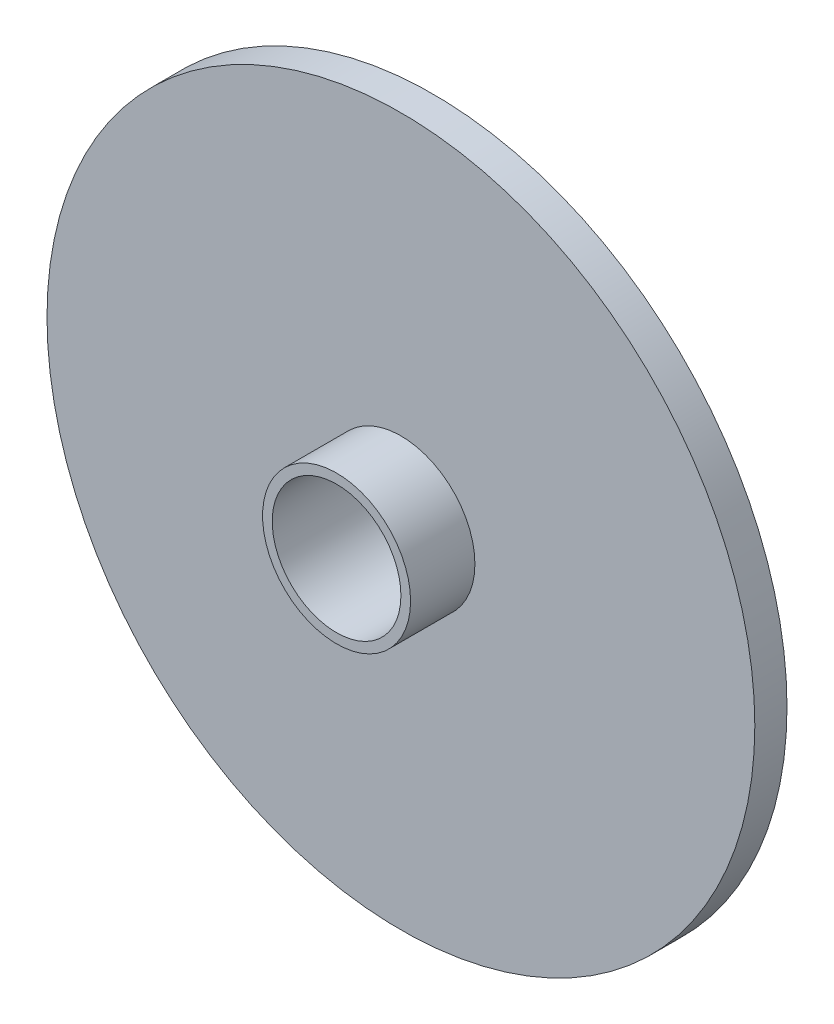
ISO-10303-21;
HEADER;
FILE_DESCRIPTION(('STEP AP214'),'2;1');
FILE_NAME('part.step','',(''),(''),'','','');
FILE_SCHEMA(('AUTOMOTIVE_DESIGN { 1 0 10303 214 1 1 1 1 }'));
ENDSEC;
DATA;
#1=APPLICATION_CONTEXT('core data for automotive mechanical design processes');
#2=APPLICATION_PROTOCOL_DEFINITION('international standard','automotive_design',2000,#1);
#3=PRODUCT_CONTEXT('',#1,'mechanical');
#4=PRODUCT('Part','Part','',(#3));
#5=PRODUCT_RELATED_PRODUCT_CATEGORY('part','',(#4));
#6=PRODUCT_DEFINITION_FORMATION('','',#4);
#7=PRODUCT_DEFINITION_CONTEXT('part definition',#1,'design');
#8=PRODUCT_DEFINITION('design','',#6,#7);
#9=PRODUCT_DEFINITION_SHAPE('','',#8);
#10=(LENGTH_UNIT() NAMED_UNIT(*) SI_UNIT(.MILLI.,.METRE.));
#11=(NAMED_UNIT(*) PLANE_ANGLE_UNIT() SI_UNIT($,.RADIAN.));
#12=(NAMED_UNIT(*) SI_UNIT($,.STERADIAN.) SOLID_ANGLE_UNIT());
#13=UNCERTAINTY_MEASURE_WITH_UNIT(LENGTH_MEASURE(1.E-05),#10,'distance_accuracy_value','');
#14=(GEOMETRIC_REPRESENTATION_CONTEXT(3) GLOBAL_UNCERTAINTY_ASSIGNED_CONTEXT((#13)) GLOBAL_UNIT_ASSIGNED_CONTEXT((#10,
#11,#12)) REPRESENTATION_CONTEXT('',''));
#15=CARTESIAN_POINT('',(0.,0.,0.));
#16=DIRECTION('',(0.,0.,1.));
#17=DIRECTION('',(1.,0.,0.));
#18=AXIS2_PLACEMENT_3D('',#15,#16,#17);
#19=CARTESIAN_POINT('',(0.,0.,5.));
#20=DIRECTION('',(0.,0.,-1.));
#21=DIRECTION('',(-1.,0.,0.));
#22=AXIS2_PLACEMENT_3D('',#19,#20,#21);
#23=CYLINDRICAL_SURFACE('',#22,55.);
#24=CARTESIAN_POINT('',(0.,0.,5.));
#25=DIRECTION('',(0.,0.,1.));
#26=DIRECTION('',(1.,0.,0.));
#27=AXIS2_PLACEMENT_3D('',#24,#25,#26);
#28=CIRCLE('',#27,55.);
#29=CARTESIAN_POINT('',(55.,0.,5.));
#30=VERTEX_POINT('',#29);
#31=EDGE_CURVE('E10',#30,#30,#28,.T.);
#32=ORIENTED_EDGE('',*,*,#31,.F.);
#33=EDGE_LOOP('',(#32));
#34=FACE_BOUND('',#33,.T.);
#35=CARTESIAN_POINT('',(0.,0.,0.));
#36=DIRECTION('',(0.,0.,1.));
#37=DIRECTION('',(1.,0.,0.));
#38=AXIS2_PLACEMENT_3D('',#35,#36,#37);
#39=CIRCLE('',#38,55.);
#40=CARTESIAN_POINT('',(55.,0.,0.));
#41=VERTEX_POINT('',#40);
#42=EDGE_CURVE('E33',#41,#41,#39,.T.);
#43=ORIENTED_EDGE('',*,*,#42,.T.);
#44=EDGE_LOOP('',(#43));
#45=FACE_BOUND('',#44,.T.);
#46=ADVANCED_FACE('F30',(#34,#45),#23,.T.);
#47=CARTESIAN_POINT('',(0.,0.,5.));
#48=DIRECTION('',(0.,0.,1.));
#49=DIRECTION('',(1.,0.,0.));
#50=AXIS2_PLACEMENT_3D('',#47,#48,#49);
#51=PLANE('',#50);
#52=CARTESIAN_POINT('',(0.,0.,5.));
#53=DIRECTION('',(0.,0.,1.));
#54=DIRECTION('',(1.,0.,0.));
#55=AXIS2_PLACEMENT_3D('',#52,#53,#54);
#56=CIRCLE('',#55,11.5);
#57=CARTESIAN_POINT('',(11.5,0.,5.));
#58=VERTEX_POINT('',#57);
#59=EDGE_CURVE('E42',#58,#58,#56,.T.);
#60=ORIENTED_EDGE('',*,*,#59,.F.);
#61=EDGE_LOOP('',(#60));
#62=FACE_BOUND('',#61,.T.);
#63=ORIENTED_EDGE('',*,*,#31,.T.);
#64=EDGE_LOOP('',(#63));
#65=FACE_BOUND('',#64,.T.);
#66=ADVANCED_FACE('F70',(#62,#65),#51,.T.);
#67=CARTESIAN_POINT('',(0.,0.,0.));
#68=DIRECTION('',(0.,0.,1.));
#69=DIRECTION('',(1.,0.,0.));
#70=AXIS2_PLACEMENT_3D('',#67,#68,#69);
#71=PLANE('',#70);
#72=CARTESIAN_POINT('',(0.,0.,0.));
#73=DIRECTION('',(0.,0.,1.));
#74=DIRECTION('',(1.,0.,0.));
#75=AXIS2_PLACEMENT_3D('',#72,#73,#74);
#76=CIRCLE('',#75,10.);
#77=CARTESIAN_POINT('',(10.,0.,0.));
#78=VERTEX_POINT('',#77);
#79=EDGE_CURVE('E50',#78,#78,#76,.T.);
#80=ORIENTED_EDGE('',*,*,#79,.T.);
#81=EDGE_LOOP('',(#80));
#82=FACE_BOUND('',#81,.T.);
#83=ORIENTED_EDGE('',*,*,#42,.F.);
#84=EDGE_LOOP('',(#83));
#85=FACE_BOUND('',#84,.T.);
#86=ADVANCED_FACE('F54',(#82,#85),#71,.F.);
#87=CARTESIAN_POINT('',(0.,0.,15.));
#88=DIRECTION('',(0.,0.,1.));
#89=DIRECTION('',(1.,0.,0.));
#90=AXIS2_PLACEMENT_3D('',#87,#88,#89);
#91=PLANE('',#90);
#92=CARTESIAN_POINT('',(0.,0.,15.));
#93=DIRECTION('',(0.,0.,1.));
#94=DIRECTION('',(1.,0.,0.));
#95=AXIS2_PLACEMENT_3D('',#92,#93,#94);
#96=CIRCLE('',#95,11.5);
#97=CARTESIAN_POINT('',(11.5,0.,15.));
#98=VERTEX_POINT('',#97);
#99=EDGE_CURVE('E40',#98,#98,#96,.T.);
#100=ORIENTED_EDGE('',*,*,#99,.T.);
#101=EDGE_LOOP('',(#100));
#102=FACE_BOUND('',#101,.T.);
#103=CARTESIAN_POINT('',(0.,0.,15.));
#104=DIRECTION('',(0.,0.,1.));
#105=DIRECTION('',(1.,0.,0.));
#106=AXIS2_PLACEMENT_3D('',#103,#104,#105);
#107=CIRCLE('',#106,10.);
#108=CARTESIAN_POINT('',(10.,0.,15.));
#109=VERTEX_POINT('',#108);
#110=EDGE_CURVE('E45',#109,#109,#107,.T.);
#111=ORIENTED_EDGE('',*,*,#110,.F.);
#112=EDGE_LOOP('',(#111));
#113=FACE_BOUND('',#112,.T.);
#114=ADVANCED_FACE('F65',(#102,#113),#91,.T.);
#115=CARTESIAN_POINT('',(0.,0.,15.));
#116=DIRECTION('',(0.,0.,-1.));
#117=DIRECTION('',(-1.,0.,0.));
#118=AXIS2_PLACEMENT_3D('',#115,#116,#117);
#119=CYLINDRICAL_SURFACE('',#118,11.5);
#120=ORIENTED_EDGE('',*,*,#99,.F.);
#121=EDGE_LOOP('',(#120));
#122=FACE_BOUND('',#121,.T.);
#123=ORIENTED_EDGE('',*,*,#59,.T.);
#124=EDGE_LOOP('',(#123));
#125=FACE_BOUND('',#124,.T.);
#126=ADVANCED_FACE('F59',(#122,#125),#119,.T.);
#127=CARTESIAN_POINT('',(0.,0.,15.));
#128=DIRECTION('',(0.,0.,-1.));
#129=DIRECTION('',(-1.,0.,0.));
#130=AXIS2_PLACEMENT_3D('',#127,#128,#129);
#131=CYLINDRICAL_SURFACE('',#130,10.);
#132=ORIENTED_EDGE('',*,*,#110,.T.);
#133=EDGE_LOOP('',(#132));
#134=FACE_BOUND('',#133,.T.);
#135=ORIENTED_EDGE('',*,*,#79,.F.);
#136=EDGE_LOOP('',(#135));
#137=FACE_BOUND('',#136,.T.);
#138=ADVANCED_FACE('F57',(#134,#137),#131,.F.);
#139=CLOSED_SHELL('',(#46,#66,#86,#114,#126,#138));
#140=MANIFOLD_SOLID_BREP('B2',#139);
#141=ADVANCED_BREP_SHAPE_REPRESENTATION('',(#18,#140),#14);
#142=SHAPE_DEFINITION_REPRESENTATION(#9,#141);
ENDSEC;
END-ISO-10303-21;
